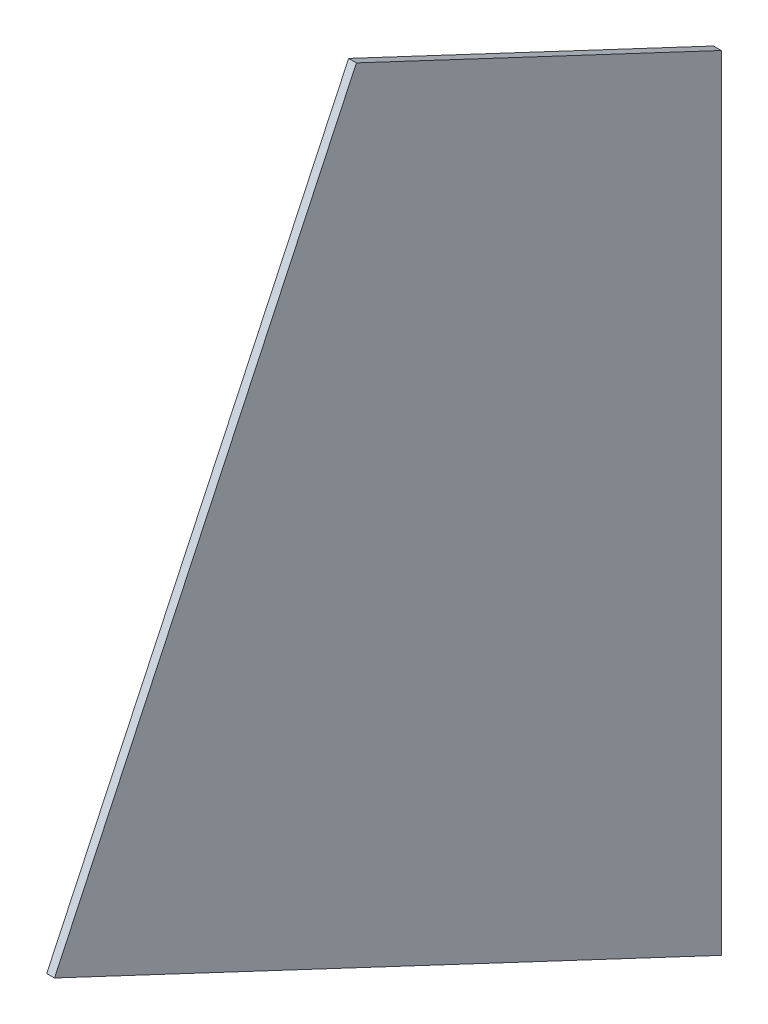
ISO-10303-21;
HEADER;
FILE_DESCRIPTION(('STEP AP214'),'2;1');
FILE_NAME('part.step','',(''),(''),'','','');
FILE_SCHEMA(('AUTOMOTIVE_DESIGN { 1 0 10303 214 1 1 1 1 }'));
ENDSEC;
DATA;
#1=APPLICATION_CONTEXT('core data for automotive mechanical design processes');
#2=APPLICATION_PROTOCOL_DEFINITION('international standard','automotive_design',2000,#1);
#3=PRODUCT_CONTEXT('',#1,'mechanical');
#4=PRODUCT('Part','Part','',(#3));
#5=PRODUCT_RELATED_PRODUCT_CATEGORY('part','',(#4));
#6=PRODUCT_DEFINITION_FORMATION('','',#4);
#7=PRODUCT_DEFINITION_CONTEXT('part definition',#1,'design');
#8=PRODUCT_DEFINITION('design','',#6,#7);
#9=PRODUCT_DEFINITION_SHAPE('','',#8);
#10=(LENGTH_UNIT() NAMED_UNIT(*) SI_UNIT(.MILLI.,.METRE.));
#11=(NAMED_UNIT(*) PLANE_ANGLE_UNIT() SI_UNIT($,.RADIAN.));
#12=(NAMED_UNIT(*) SI_UNIT($,.STERADIAN.) SOLID_ANGLE_UNIT());
#13=UNCERTAINTY_MEASURE_WITH_UNIT(LENGTH_MEASURE(1.E-05),#10,'distance_accuracy_value','');
#14=(GEOMETRIC_REPRESENTATION_CONTEXT(3) GLOBAL_UNCERTAINTY_ASSIGNED_CONTEXT((#13)) GLOBAL_UNIT_ASSIGNED_CONTEXT((#10,
#11,#12)) REPRESENTATION_CONTEXT('',''));
#15=CARTESIAN_POINT('',(0.,0.,0.));
#16=DIRECTION('',(0.,0.,1.));
#17=DIRECTION('',(1.,0.,0.));
#18=AXIS2_PLACEMENT_3D('',#15,#16,#17);
#19=CARTESIAN_POINT('',(0.,0.,0.));
#20=DIRECTION('',(0.,0.,-1.));
#21=DIRECTION('',(-1.,0.,0.));
#22=AXIS2_PLACEMENT_3D('',#19,#20,#21);
#23=PLANE('',#22);
#24=DIRECTION('',(-1.,0.,0.));
#25=VECTOR('',#24,1.);
#26=CARTESIAN_POINT('',(-5.75183835526145,-436.236959802916,0.));
#27=LINE('',#26,#25);
#28=CARTESIAN_POINT('',(0.59816164473855,-436.236959802916,0.));
#29=VERTEX_POINT('',#28);
#30=CARTESIAN_POINT('',(-5.75183835526145,-436.236959802916,0.));
#31=VERTEX_POINT('',#30);
#32=EDGE_CURVE('E89',#29,#31,#27,.T.);
#33=ORIENTED_EDGE('',*,*,#32,.F.);
#34=DIRECTION('',(0.,1.,0.));
#35=VECTOR('',#34,1.);
#36=CARTESIAN_POINT('',(0.59816164473855,-436.236959802916,0.));
#37=LINE('',#36,#35);
#38=CARTESIAN_POINT('',(0.59816164473855,-1074.7731472991,0.));
#39=VERTEX_POINT('',#38);
#40=EDGE_CURVE('E100',#39,#29,#37,.T.);
#41=ORIENTED_EDGE('',*,*,#40,.F.);
#42=DIRECTION('',(1.,0.,0.));
#43=VECTOR('',#42,1.);
#44=CARTESIAN_POINT('',(0.59816164473855,-1074.7731472991,0.));
#45=LINE('',#44,#43);
#46=CARTESIAN_POINT('',(-5.75183835526145,-1074.7731472991,0.));
#47=VERTEX_POINT('',#46);
#48=EDGE_CURVE('E91',#47,#39,#45,.T.);
#49=ORIENTED_EDGE('',*,*,#48,.F.);
#50=DIRECTION('',(0.,-1.,0.));
#51=VECTOR('',#50,1.);
#52=CARTESIAN_POINT('',(-5.75183835526145,-1074.7731472991,0.));
#53=LINE('',#52,#51);
#54=EDGE_CURVE('E81',#31,#47,#53,.T.);
#55=ORIENTED_EDGE('',*,*,#54,.F.);
#56=EDGE_LOOP('',(#33,#41,#49,#55));
#57=FACE_BOUND('',#56,.T.);
#58=ADVANCED_FACE('F39',(#57),#23,.T.);
#59=CARTESIAN_POINT('',(0.59816164473855,33.4560959731387,998.097743524117));
#60=DIRECTION('',(-1.,0.,0.));
#61=DIRECTION('',(0.,0.,1.));
#62=AXIS2_PLACEMENT_3D('',#59,#60,#61);
#63=PLANE('',#62);
#64=DIRECTION('',(0.,-0.42579703632988,-0.904818702200994));
#65=VECTOR('',#64,1.);
#66=CARTESIAN_POINT('',(0.59816164473855,33.4560959731387,998.097743524117));
#67=LINE('',#66,#65);
#68=CARTESIAN_POINT('',(0.59816164473855,-296.328464390602,297.305552751168));
#69=VERTEX_POINT('',#68);
#70=EDGE_CURVE('E94',#69,#29,#67,.T.);
#71=ORIENTED_EDGE('',*,*,#70,.F.);
#72=DIRECTION('',(0.,-0.904818702200994,0.42579703632988));
#73=VECTOR('',#72,1.);
#74=CARTESIAN_POINT('',(0.59816164473855,-296.328464390603,297.305552751167));
#75=LINE('',#74,#73);
#76=CARTESIAN_POINT('',(0.59816164473855,-819.096051320908,543.313828953664));
#77=VERTEX_POINT('',#76);
#78=EDGE_CURVE('E43',#69,#77,#75,.T.);
#79=ORIENTED_EDGE('',*,*,#78,.T.);
#80=DIRECTION('',(0.,-0.42579703632988,-0.904818702200994));
#81=VECTOR('',#80,1.);
#82=CARTESIAN_POINT('',(0.59816164473855,-605.080091523047,998.097743524117));
#83=LINE('',#82,#81);
#84=EDGE_CURVE('E103',#77,#39,#83,.T.);
#85=ORIENTED_EDGE('',*,*,#84,.T.);
#86=ORIENTED_EDGE('',*,*,#40,.T.);
#87=EDGE_LOOP('',(#71,#79,#85,#86));
#88=FACE_BOUND('',#87,.T.);
#89=ADVANCED_FACE('F112',(#88),#63,.F.);
#90=CARTESIAN_POINT('',(0.59816164473855,-605.080091523047,998.097743524117));
#91=DIRECTION('',(0.,0.904818702200994,-0.42579703632988));
#92=DIRECTION('',(0.,0.42579703632988,0.904818702200994));
#93=AXIS2_PLACEMENT_3D('',#90,#91,#92);
#94=PLANE('',#93);
#95=ORIENTED_EDGE('',*,*,#84,.F.);
#96=DIRECTION('',(-1.,0.,0.));
#97=VECTOR('',#96,1.);
#98=CARTESIAN_POINT('',(0.59816164473855,-819.096051320908,543.313828953664));
#99=LINE('',#98,#97);
#100=CARTESIAN_POINT('',(-5.75183835526145,-819.096051320908,543.313828953664));
#101=VERTEX_POINT('',#100);
#102=EDGE_CURVE('E109',#77,#101,#99,.T.);
#103=ORIENTED_EDGE('',*,*,#102,.T.);
#104=DIRECTION('',(0.,-0.42579703632988,-0.904818702200994));
#105=VECTOR('',#104,1.);
#106=CARTESIAN_POINT('',(-5.75183835526145,-605.080091523047,998.097743524117));
#107=LINE('',#106,#105);
#108=EDGE_CURVE('E85',#101,#47,#107,.T.);
#109=ORIENTED_EDGE('',*,*,#108,.T.);
#110=ORIENTED_EDGE('',*,*,#48,.T.);
#111=EDGE_LOOP('',(#95,#103,#109,#110));
#112=FACE_BOUND('',#111,.T.);
#113=ADVANCED_FACE('F108',(#112),#94,.F.);
#114=CARTESIAN_POINT('',(-5.75183835526145,-605.080091523047,998.097743524117));
#115=DIRECTION('',(1.,0.,0.));
#116=DIRECTION('',(0.,0.,-1.));
#117=AXIS2_PLACEMENT_3D('',#114,#115,#116);
#118=PLANE('',#117);
#119=ORIENTED_EDGE('',*,*,#108,.F.);
#120=DIRECTION('',(0.,0.904818702200994,-0.42579703632988));
#121=VECTOR('',#120,1.);
#122=CARTESIAN_POINT('',(-5.75183835526145,-819.096051320908,543.313828953664));
#123=LINE('',#122,#121);
#124=CARTESIAN_POINT('',(-5.75183835526145,-296.328464390602,297.305552751167));
#125=VERTEX_POINT('',#124);
#126=EDGE_CURVE('E48',#101,#125,#123,.T.);
#127=ORIENTED_EDGE('',*,*,#126,.T.);
#128=DIRECTION('',(0.,-0.42579703632988,-0.904818702200994));
#129=VECTOR('',#128,1.);
#130=CARTESIAN_POINT('',(-5.75183835526145,33.4560959731387,998.097743524117));
#131=LINE('',#130,#129);
#132=EDGE_CURVE('E78',#125,#31,#131,.T.);
#133=ORIENTED_EDGE('',*,*,#132,.T.);
#134=ORIENTED_EDGE('',*,*,#54,.T.);
#135=EDGE_LOOP('',(#119,#127,#133,#134));
#136=FACE_BOUND('',#135,.T.);
#137=ADVANCED_FACE('F80',(#136),#118,.F.);
#138=CARTESIAN_POINT('',(-5.75183835526145,33.4560959731387,998.097743524117));
#139=DIRECTION('',(0.,-0.904818702200994,0.42579703632988));
#140=DIRECTION('',(0.,-0.42579703632988,-0.904818702200994));
#141=AXIS2_PLACEMENT_3D('',#138,#139,#140);
#142=PLANE('',#141);
#143=ORIENTED_EDGE('',*,*,#132,.F.);
#144=DIRECTION('',(1.,0.,0.));
#145=VECTOR('',#144,1.);
#146=CARTESIAN_POINT('',(-5.75183835526145,-296.328464390603,297.305552751167));
#147=LINE('',#146,#145);
#148=EDGE_CURVE('E11',#125,#69,#147,.T.);
#149=ORIENTED_EDGE('',*,*,#148,.T.);
#150=ORIENTED_EDGE('',*,*,#70,.T.);
#151=ORIENTED_EDGE('',*,*,#32,.T.);
#152=EDGE_LOOP('',(#143,#149,#150,#151));
#153=FACE_BOUND('',#152,.T.);
#154=ADVANCED_FACE('F41',(#153),#142,.F.);
#155=CARTESIAN_POINT('',(-612.176838355262,-298.724627816382,298.433159069181));
#156=DIRECTION('',(0.,-0.42579703632988,-0.904818702200994));
#157=DIRECTION('',(0.,0.904818702200994,-0.42579703632988));
#158=AXIS2_PLACEMENT_3D('',#155,#156,#157);
#159=PLANE('',#158);
#160=ORIENTED_EDGE('',*,*,#126,.F.);
#161=ORIENTED_EDGE('',*,*,#102,.F.);
#162=ORIENTED_EDGE('',*,*,#78,.F.);
#163=ORIENTED_EDGE('',*,*,#148,.F.);
#164=EDGE_LOOP('',(#160,#161,#162,#163));
#165=FACE_BOUND('',#164,.T.);
#166=ADVANCED_FACE('F126',(#165),#159,.F.);
#167=CLOSED_SHELL('',(#58,#89,#113,#137,#154,#166));
#168=MANIFOLD_SOLID_BREP('B2',#167);
#169=ADVANCED_BREP_SHAPE_REPRESENTATION('',(#18,#168),#14);
#170=SHAPE_DEFINITION_REPRESENTATION(#9,#169);
ENDSEC;
END-ISO-10303-21;
